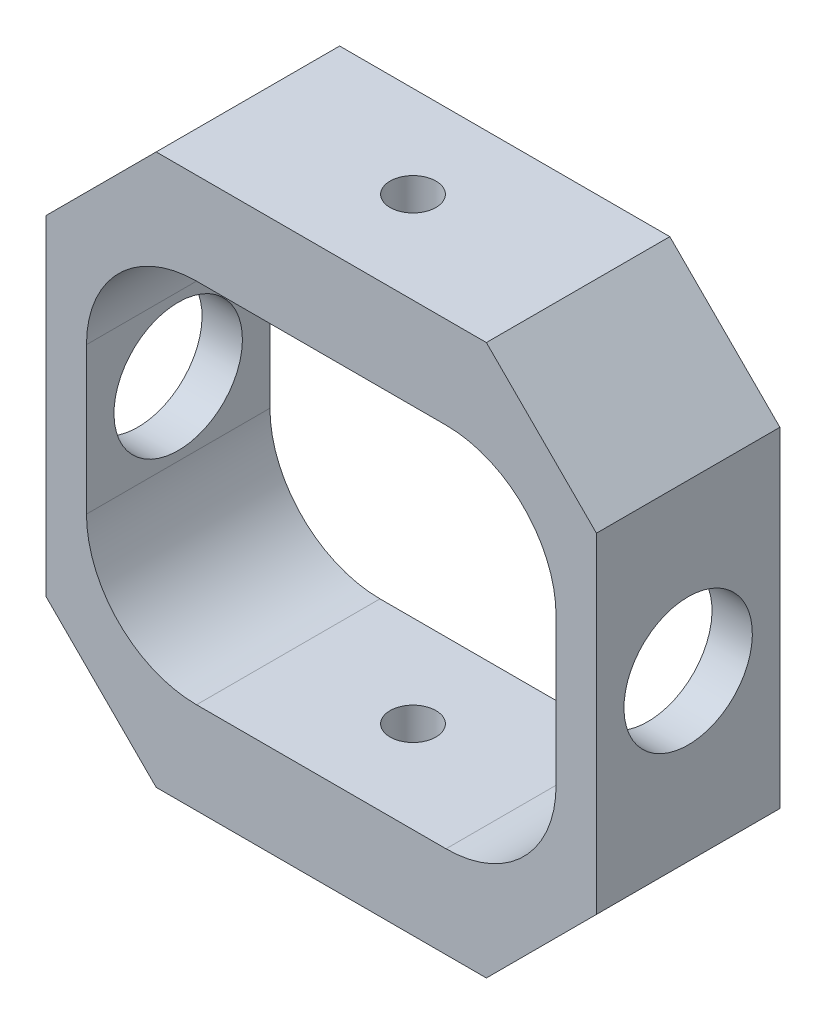
ISO-10303-21;
HEADER;
FILE_DESCRIPTION(('STEP AP214'),'2;1');
FILE_NAME('part.step','',(''),(''),'','','');
FILE_SCHEMA(('AUTOMOTIVE_DESIGN { 1 0 10303 214 1 1 1 1 }'));
ENDSEC;
DATA;
#1=APPLICATION_CONTEXT('core data for automotive mechanical design processes');
#2=APPLICATION_PROTOCOL_DEFINITION('international standard','automotive_design',2000,#1);
#3=PRODUCT_CONTEXT('',#1,'mechanical');
#4=PRODUCT('Part','Part','',(#3));
#5=PRODUCT_RELATED_PRODUCT_CATEGORY('part','',(#4));
#6=PRODUCT_DEFINITION_FORMATION('','',#4);
#7=PRODUCT_DEFINITION_CONTEXT('part definition',#1,'design');
#8=PRODUCT_DEFINITION('design','',#6,#7);
#9=PRODUCT_DEFINITION_SHAPE('','',#8);
#10=(LENGTH_UNIT() NAMED_UNIT(*) SI_UNIT(.MILLI.,.METRE.));
#11=(NAMED_UNIT(*) PLANE_ANGLE_UNIT() SI_UNIT($,.RADIAN.));
#12=(NAMED_UNIT(*) SI_UNIT($,.STERADIAN.) SOLID_ANGLE_UNIT());
#13=UNCERTAINTY_MEASURE_WITH_UNIT(LENGTH_MEASURE(1.E-05),#10,'distance_accuracy_value','');
#14=(GEOMETRIC_REPRESENTATION_CONTEXT(3) GLOBAL_UNCERTAINTY_ASSIGNED_CONTEXT((#13)) GLOBAL_UNIT_ASSIGNED_CONTEXT((#10,
#11,#12)) REPRESENTATION_CONTEXT('',''));
#15=CARTESIAN_POINT('',(0.,0.,0.));
#16=DIRECTION('',(0.,0.,1.));
#17=DIRECTION('',(1.,0.,0.));
#18=AXIS2_PLACEMENT_3D('',#15,#16,#17);
#19=CARTESIAN_POINT('',(5.2510703105545,667.332012286217,-379.357743681072));
#20=DIRECTION('',(1.,0.,0.));
#21=DIRECTION('',(0.,1.,0.));
#22=AXIS2_PLACEMENT_3D('',#19,#20,#21);
#23=CYLINDRICAL_SURFACE('',#22,3.5);
#24=CARTESIAN_POINT('',(-12.8000000000002,667.332012286217,-379.357743681072));
#25=DIRECTION('',(1.,0.,0.));
#26=DIRECTION('',(0.,1.,0.));
#27=AXIS2_PLACEMENT_3D('',#24,#25,#26);
#28=CIRCLE('',#27,3.5);
#29=CARTESIAN_POINT('',(-12.8000000000002,670.832012286217,-379.357743681072));
#30=VERTEX_POINT('',#29);
#31=EDGE_CURVE('E154',#30,#30,#28,.F.);
#32=ORIENTED_EDGE('',*,*,#31,.F.);
#33=EDGE_LOOP('',(#32));
#34=FACE_BOUND('',#33,.T.);
#35=CARTESIAN_POINT('',(-15.0000000000005,667.332012286217,-379.357743681072));
#36=DIRECTION('',(1.,0.,0.));
#37=DIRECTION('',(0.,1.,0.));
#38=AXIS2_PLACEMENT_3D('',#35,#36,#37);
#39=CIRCLE('',#38,3.5);
#40=CARTESIAN_POINT('',(-15.0000000000005,670.832012286217,-379.357743681072));
#41=VERTEX_POINT('',#40);
#42=EDGE_CURVE('E203',#41,#41,#39,.F.);
#43=ORIENTED_EDGE('',*,*,#42,.T.);
#44=EDGE_LOOP('',(#43));
#45=FACE_BOUND('',#44,.T.);
#46=ADVANCED_FACE('F17',(#34,#45),#23,.F.);
#47=CARTESIAN_POINT('',(-4.547474E-13,660.706835932994,-379.357743681072));
#48=DIRECTION('',(0.,-1.,0.));
#49=DIRECTION('',(1.,0.,0.));
#50=AXIS2_PLACEMENT_3D('',#47,#48,#49);
#51=CYLINDRICAL_SURFACE('',#50,1.25);
#52=CARTESIAN_POINT('',(-4.45973166346161E-13,682.332012286217,-379.357743681072));
#53=DIRECTION('',(0.,-1.,0.));
#54=DIRECTION('',(1.,0.,0.));
#55=AXIS2_PLACEMENT_3D('',#52,#53,#54);
#56=CIRCLE('',#55,1.25);
#57=CARTESIAN_POINT('',(1.24999999999955,682.332012286217,-379.357743681072));
#58=VERTEX_POINT('',#57);
#59=EDGE_CURVE('E20',#58,#58,#56,.F.);
#60=ORIENTED_EDGE('',*,*,#59,.T.);
#61=EDGE_LOOP('',(#60));
#62=FACE_BOUND('',#61,.T.);
#63=CARTESIAN_POINT('',(-4.48001874346161E-13,677.332012286217,-379.357743681072));
#64=DIRECTION('',(0.,-1.,0.));
#65=DIRECTION('',(1.,0.,0.));
#66=AXIS2_PLACEMENT_3D('',#63,#64,#65);
#67=CIRCLE('',#66,1.25);
#68=CARTESIAN_POINT('',(1.24999999999955,677.332012286217,-379.357743681072));
#69=VERTEX_POINT('',#68);
#70=EDGE_CURVE('E163',#69,#69,#67,.F.);
#71=ORIENTED_EDGE('',*,*,#70,.F.);
#72=EDGE_LOOP('',(#71));
#73=FACE_BOUND('',#72,.T.);
#74=ADVANCED_FACE('F353',(#62,#73),#51,.F.);
#75=CARTESIAN_POINT('',(5.2510703105545,667.332012286217,-379.357743681072));
#76=DIRECTION('',(1.,0.,0.));
#77=DIRECTION('',(0.,1.,0.));
#78=AXIS2_PLACEMENT_3D('',#75,#76,#77);
#79=CYLINDRICAL_SURFACE('',#78,3.5);
#80=CARTESIAN_POINT('',(12.7999999999993,667.332012286217,-379.357743681072));
#81=DIRECTION('',(1.,0.,0.));
#82=DIRECTION('',(0.,1.,0.));
#83=AXIS2_PLACEMENT_3D('',#80,#81,#82);
#84=CIRCLE('',#83,3.5);
#85=CARTESIAN_POINT('',(12.7999999999993,670.832012286217,-379.357743681072));
#86=VERTEX_POINT('',#85);
#87=EDGE_CURVE('E159',#86,#86,#84,.T.);
#88=ORIENTED_EDGE('',*,*,#87,.F.);
#89=EDGE_LOOP('',(#88));
#90=FACE_BOUND('',#89,.T.);
#91=CARTESIAN_POINT('',(14.9999999999995,667.332012286217,-379.357743681072));
#92=DIRECTION('',(1.,0.,0.));
#93=DIRECTION('',(0.,1.,0.));
#94=AXIS2_PLACEMENT_3D('',#91,#92,#93);
#95=CIRCLE('',#94,3.5);
#96=CARTESIAN_POINT('',(14.9999999999995,670.832012286217,-379.357743681072));
#97=VERTEX_POINT('',#96);
#98=EDGE_CURVE('E155',#97,#97,#95,.T.);
#99=ORIENTED_EDGE('',*,*,#98,.T.);
#100=EDGE_LOOP('',(#99));
#101=FACE_BOUND('',#100,.T.);
#102=ADVANCED_FACE('F345',(#90,#101),#79,.F.);
#103=CARTESIAN_POINT('',(-4.547474E-13,660.706835932994,-379.357743681072));
#104=DIRECTION('',(0.,-1.,0.));
#105=DIRECTION('',(1.,0.,0.));
#106=AXIS2_PLACEMENT_3D('',#103,#104,#105);
#107=CYLINDRICAL_SURFACE('',#106,1.25);
#108=CARTESIAN_POINT('',(-4.58145414346161E-13,652.332012286217,-379.357743681072));
#109=DIRECTION('',(0.,-1.,0.));
#110=DIRECTION('',(1.,0.,0.));
#111=AXIS2_PLACEMENT_3D('',#108,#109,#110);
#112=CIRCLE('',#111,1.25);
#113=CARTESIAN_POINT('',(1.24999999999954,652.332012286217,-379.357743681072));
#114=VERTEX_POINT('',#113);
#115=EDGE_CURVE('E199',#114,#114,#112,.T.);
#116=ORIENTED_EDGE('',*,*,#115,.T.);
#117=EDGE_LOOP('',(#116));
#118=FACE_BOUND('',#117,.T.);
#119=CARTESIAN_POINT('',(-4.56116706346161E-13,657.332012286217,-379.357743681072));
#120=DIRECTION('',(0.,-1.,0.));
#121=DIRECTION('',(1.,0.,0.));
#122=AXIS2_PLACEMENT_3D('',#119,#120,#121);
#123=CIRCLE('',#122,1.25);
#124=CARTESIAN_POINT('',(1.24999999999954,657.332012286217,-379.357743681072));
#125=VERTEX_POINT('',#124);
#126=EDGE_CURVE('E151',#125,#125,#123,.T.);
#127=ORIENTED_EDGE('',*,*,#126,.F.);
#128=EDGE_LOOP('',(#127));
#129=FACE_BOUND('',#128,.T.);
#130=ADVANCED_FACE('F343',(#118,#129),#107,.F.);
#131=CARTESIAN_POINT('',(-4.547474E-13,667.332012286217,-384.357743681072));
#132=DIRECTION('',(0.,0.,1.));
#133=DIRECTION('',(1.,0.,0.));
#134=AXIS2_PLACEMENT_3D('',#131,#132,#133);
#135=PLANE('',#134);
#136=CARTESIAN_POINT('',(-6.80000000000018,663.332012286217,-384.357743681072));
#137=DIRECTION('',(0.,0.,-1.));
#138=DIRECTION('',(-1.,0.,0.));
#139=AXIS2_PLACEMENT_3D('',#136,#137,#138);
#140=CIRCLE('',#139,6.);
#141=CARTESIAN_POINT('',(-12.8000000000002,663.332012286217,-384.357743681072));
#142=VERTEX_POINT('',#141);
#143=CARTESIAN_POINT('',(-6.80000000000018,657.332012286217,-384.357743681072));
#144=VERTEX_POINT('',#143);
#145=EDGE_CURVE('E178',#142,#144,#140,.F.);
#146=ORIENTED_EDGE('',*,*,#145,.T.);
#147=DIRECTION('',(1.,0.,0.));
#148=VECTOR('',#147,1.);
#149=CARTESIAN_POINT('',(0.999999999999545,657.332012286217,-384.357743681072));
#150=LINE('',#149,#148);
#151=CARTESIAN_POINT('',(6.79999999999927,657.332012286217,-384.357743681072));
#152=VERTEX_POINT('',#151);
#153=EDGE_CURVE('E149',#152,#144,#150,.F.);
#154=ORIENTED_EDGE('',*,*,#153,.F.);
#155=CARTESIAN_POINT('',(6.79999999999927,663.332012286217,-384.357743681072));
#156=DIRECTION('',(0.,0.,-1.));
#157=DIRECTION('',(-1.,0.,0.));
#158=AXIS2_PLACEMENT_3D('',#155,#156,#157);
#159=CIRCLE('',#158,6.);
#160=CARTESIAN_POINT('',(12.7999999999993,663.332012286217,-384.357743681072));
#161=VERTEX_POINT('',#160);
#162=EDGE_CURVE('E183',#152,#161,#159,.F.);
#163=ORIENTED_EDGE('',*,*,#162,.T.);
#164=DIRECTION('',(0.,1.,0.));
#165=VECTOR('',#164,1.);
#166=CARTESIAN_POINT('',(12.7999999999993,667.332012286217,-384.357743681072));
#167=LINE('',#166,#165);
#168=CARTESIAN_POINT('',(12.7999999999993,671.332012286217,-384.357743681072));
#169=VERTEX_POINT('',#168);
#170=EDGE_CURVE('E156',#169,#161,#167,.F.);
#171=ORIENTED_EDGE('',*,*,#170,.F.);
#172=CARTESIAN_POINT('',(6.79999999999927,671.332012286217,-384.357743681072));
#173=DIRECTION('',(0.,0.,-1.));
#174=DIRECTION('',(-1.,0.,0.));
#175=AXIS2_PLACEMENT_3D('',#172,#173,#174);
#176=CIRCLE('',#175,6.);
#177=CARTESIAN_POINT('',(6.79999999999927,677.332012286217,-384.357743681072));
#178=VERTEX_POINT('',#177);
#179=EDGE_CURVE('E188',#169,#178,#176,.F.);
#180=ORIENTED_EDGE('',*,*,#179,.T.);
#181=DIRECTION('',(1.,0.,0.));
#182=VECTOR('',#181,1.);
#183=CARTESIAN_POINT('',(0.999999999999545,677.332012286217,-384.357743681072));
#184=LINE('',#183,#182);
#185=CARTESIAN_POINT('',(-6.80000000000018,677.332012286217,-384.357743681072));
#186=VERTEX_POINT('',#185);
#187=EDGE_CURVE('E161',#186,#178,#184,.T.);
#188=ORIENTED_EDGE('',*,*,#187,.F.);
#189=CARTESIAN_POINT('',(-6.80000000000018,671.332012286217,-384.357743681072));
#190=DIRECTION('',(0.,0.,1.));
#191=DIRECTION('',(1.,0.,0.));
#192=AXIS2_PLACEMENT_3D('',#189,#190,#191);
#193=CIRCLE('',#192,6.);
#194=CARTESIAN_POINT('',(-12.8000000000002,671.332012286217,-384.357743681072));
#195=VERTEX_POINT('',#194);
#196=EDGE_CURVE('E85',#186,#195,#193,.T.);
#197=ORIENTED_EDGE('',*,*,#196,.T.);
#198=DIRECTION('',(0.,1.,0.));
#199=VECTOR('',#198,1.);
#200=CARTESIAN_POINT('',(-12.8000000000002,667.332012286217,-384.357743681072));
#201=LINE('',#200,#199);
#202=EDGE_CURVE('E91',#142,#195,#201,.T.);
#203=ORIENTED_EDGE('',*,*,#202,.F.);
#204=EDGE_LOOP('',(#146,#154,#163,#171,#180,#188,#197,#203));
#205=FACE_BOUND('',#204,.T.);
#206=DIRECTION('',(0.,1.,0.));
#207=VECTOR('',#206,1.);
#208=CARTESIAN_POINT('',(14.9999999999995,667.332012286217,-384.357743681072));
#209=LINE('',#208,#207);
#210=CARTESIAN_POINT('',(14.9999999999995,676.332012286217,-384.357743681072));
#211=VERTEX_POINT('',#210);
#212=CARTESIAN_POINT('',(14.9999999999995,658.332012286217,-384.357743681072));
#213=VERTEX_POINT('',#212);
#214=EDGE_CURVE('E99',#211,#213,#209,.F.);
#215=ORIENTED_EDGE('',*,*,#214,.T.);
#216=DIRECTION('',(0.707106781186548,0.707106781186547,0.));
#217=VECTOR('',#216,1.);
#218=CARTESIAN_POINT('',(11.9999999999995,655.332012286217,-384.357743681072));
#219=LINE('',#218,#217);
#220=CARTESIAN_POINT('',(8.99999999999954,652.332012286217,-384.357743681072));
#221=VERTEX_POINT('',#220);
#222=EDGE_CURVE('E201',#221,#213,#219,.T.);
#223=ORIENTED_EDGE('',*,*,#222,.F.);
#224=DIRECTION('',(1.,0.,0.));
#225=VECTOR('',#224,1.);
#226=CARTESIAN_POINT('',(-4.547474E-13,652.332012286217,-384.357743681072));
#227=LINE('',#226,#225);
#228=CARTESIAN_POINT('',(-9.00000000000046,652.332012286217,-384.357743681072));
#229=VERTEX_POINT('',#228);
#230=EDGE_CURVE('E271',#221,#229,#227,.F.);
#231=ORIENTED_EDGE('',*,*,#230,.T.);
#232=DIRECTION('',(0.707106781186547,-0.707106781186548,0.));
#233=VECTOR('',#232,1.);
#234=CARTESIAN_POINT('',(-12.0000000000005,655.332012286217,-384.357743681072));
#235=LINE('',#234,#233);
#236=CARTESIAN_POINT('',(-15.0000000000005,658.332012286217,-384.357743681072));
#237=VERTEX_POINT('',#236);
#238=EDGE_CURVE('E205',#237,#229,#235,.T.);
#239=ORIENTED_EDGE('',*,*,#238,.F.);
#240=DIRECTION('',(0.,1.,0.));
#241=VECTOR('',#240,1.);
#242=CARTESIAN_POINT('',(-15.0000000000005,667.332012286217,-384.357743681072));
#243=LINE('',#242,#241);
#244=CARTESIAN_POINT('',(-15.0000000000005,676.332012286217,-384.357743681072));
#245=VERTEX_POINT('',#244);
#246=EDGE_CURVE('E213',#237,#245,#243,.T.);
#247=ORIENTED_EDGE('',*,*,#246,.T.);
#248=DIRECTION('',(-0.707106781186548,-0.707106781186547,0.));
#249=VECTOR('',#248,1.);
#250=CARTESIAN_POINT('',(-12.0000000000005,679.332012286217,-384.357743681072));
#251=LINE('',#250,#249);
#252=CARTESIAN_POINT('',(-9.00000000000046,682.332012286217,-384.357743681072));
#253=VERTEX_POINT('',#252);
#254=EDGE_CURVE('E118',#253,#245,#251,.T.);
#255=ORIENTED_EDGE('',*,*,#254,.F.);
#256=DIRECTION('',(1.,0.,0.));
#257=VECTOR('',#256,1.);
#258=CARTESIAN_POINT('',(-4.547474E-13,682.332012286217,-384.357743681072));
#259=LINE('',#258,#257);
#260=CARTESIAN_POINT('',(8.99999999999954,682.332012286217,-384.357743681072));
#261=VERTEX_POINT('',#260);
#262=EDGE_CURVE('E120',#253,#261,#259,.T.);
#263=ORIENTED_EDGE('',*,*,#262,.T.);
#264=DIRECTION('',(-0.707106781186547,0.707106781186548,0.));
#265=VECTOR('',#264,1.);
#266=CARTESIAN_POINT('',(11.9999999999995,679.332012286217,-384.357743681072));
#267=LINE('',#266,#265);
#268=EDGE_CURVE('E123',#211,#261,#267,.T.);
#269=ORIENTED_EDGE('',*,*,#268,.F.);
#270=EDGE_LOOP('',(#215,#223,#231,#239,#247,#255,#263,#269));
#271=FACE_BOUND('',#270,.T.);
#272=ADVANCED_FACE('F122',(#205,#271),#135,.F.);
#273=CARTESIAN_POINT('',(11.9999999999995,679.332012286217,-379.357743681072));
#274=DIRECTION('',(0.707106781186548,0.707106781186547,0.));
#275=DIRECTION('',(-0.707106781186547,0.707106781186548,0.));
#276=AXIS2_PLACEMENT_3D('',#273,#274,#275);
#277=PLANE('',#276);
#278=DIRECTION('',(-0.707106781186544,0.707106781186551,0.));
#279=VECTOR('',#278,1.);
#280=CARTESIAN_POINT('',(14.9999999999995,676.332012286217,-374.357743681072));
#281=LINE('',#280,#279);
#282=CARTESIAN_POINT('',(14.9999999999995,676.332012286217,-374.357743681072));
#283=VERTEX_POINT('',#282);
#284=CARTESIAN_POINT('',(8.99999999999953,682.332012286217,-374.357743681072));
#285=VERTEX_POINT('',#284);
#286=EDGE_CURVE('E244',#283,#285,#281,.T.);
#287=ORIENTED_EDGE('',*,*,#286,.F.);
#288=DIRECTION('',(0.,0.,1.));
#289=VECTOR('',#288,1.);
#290=CARTESIAN_POINT('',(14.9999999999995,676.332012286217,-379.357743681072));
#291=LINE('',#290,#289);
#292=EDGE_CURVE('E138',#283,#211,#291,.F.);
#293=ORIENTED_EDGE('',*,*,#292,.T.);
#294=ORIENTED_EDGE('',*,*,#268,.T.);
#295=DIRECTION('',(0.,0.,-1.));
#296=VECTOR('',#295,1.);
#297=CARTESIAN_POINT('',(8.99999999999955,682.332012286217,-379.357743681072));
#298=LINE('',#297,#296);
#299=EDGE_CURVE('E129',#261,#285,#298,.F.);
#300=ORIENTED_EDGE('',*,*,#299,.T.);
#301=EDGE_LOOP('',(#287,#293,#294,#300));
#302=FACE_BOUND('',#301,.T.);
#303=ADVANCED_FACE('F134',(#302),#277,.T.);
#304=CARTESIAN_POINT('',(-4.547474E-13,682.332012286217,-379.357743681072));
#305=DIRECTION('',(0.,-1.,0.));
#306=DIRECTION('',(0.,0.,-1.));
#307=AXIS2_PLACEMENT_3D('',#304,#305,#306);
#308=PLANE('',#307);
#309=ORIENTED_EDGE('',*,*,#59,.F.);
#310=EDGE_LOOP('',(#309));
#311=FACE_BOUND('',#310,.T.);
#312=ORIENTED_EDGE('',*,*,#262,.F.);
#313=DIRECTION('',(0.,0.,1.));
#314=VECTOR('',#313,1.);
#315=CARTESIAN_POINT('',(-9.00000000000048,682.332012286217,-379.357743681072));
#316=LINE('',#315,#314);
#317=CARTESIAN_POINT('',(-9.00000000000046,682.332012286217,-374.357743681072));
#318=VERTEX_POINT('',#317);
#319=EDGE_CURVE('E220',#318,#253,#316,.F.);
#320=ORIENTED_EDGE('',*,*,#319,.F.);
#321=DIRECTION('',(1.,0.,0.));
#322=VECTOR('',#321,1.);
#323=CARTESIAN_POINT('',(-4.547474E-13,682.332012286217,-374.357743681072));
#324=LINE('',#323,#322);
#325=EDGE_CURVE('E142',#285,#318,#324,.F.);
#326=ORIENTED_EDGE('',*,*,#325,.F.);
#327=ORIENTED_EDGE('',*,*,#299,.F.);
#328=EDGE_LOOP('',(#312,#320,#326,#327));
#329=FACE_BOUND('',#328,.T.);
#330=ADVANCED_FACE('F140',(#311,#329),#308,.F.);
#331=CARTESIAN_POINT('',(-12.0000000000005,679.332012286217,-379.357743681072));
#332=DIRECTION('',(-0.707106781186547,0.707106781186548,0.));
#333=DIRECTION('',(-0.707106781186548,-0.707106781186547,0.));
#334=AXIS2_PLACEMENT_3D('',#331,#332,#333);
#335=PLANE('',#334);
#336=DIRECTION('',(-0.70710678118655,-0.707106781186545,0.));
#337=VECTOR('',#336,1.);
#338=CARTESIAN_POINT('',(-9.00000000000045,682.332012286217,-374.357743681072));
#339=LINE('',#338,#337);
#340=CARTESIAN_POINT('',(-15.0000000000005,676.332012286217,-374.357743681072));
#341=VERTEX_POINT('',#340);
#342=EDGE_CURVE('E239',#318,#341,#339,.T.);
#343=ORIENTED_EDGE('',*,*,#342,.F.);
#344=ORIENTED_EDGE('',*,*,#319,.T.);
#345=ORIENTED_EDGE('',*,*,#254,.T.);
#346=DIRECTION('',(0.,0.,-1.));
#347=VECTOR('',#346,1.);
#348=CARTESIAN_POINT('',(-15.0000000000005,676.332012286217,-379.357743681072));
#349=LINE('',#348,#347);
#350=EDGE_CURVE('E206',#245,#341,#349,.F.);
#351=ORIENTED_EDGE('',*,*,#350,.T.);
#352=EDGE_LOOP('',(#343,#344,#345,#351));
#353=FACE_BOUND('',#352,.T.);
#354=ADVANCED_FACE('F223',(#353),#335,.T.);
#355=CARTESIAN_POINT('',(-15.0000000000005,667.332012286217,-379.357743681072));
#356=DIRECTION('',(1.,0.,0.));
#357=DIRECTION('',(0.,0.,-1.));
#358=AXIS2_PLACEMENT_3D('',#355,#356,#357);
#359=PLANE('',#358);
#360=ORIENTED_EDGE('',*,*,#42,.F.);
#361=EDGE_LOOP('',(#360));
#362=FACE_BOUND('',#361,.T.);
#363=ORIENTED_EDGE('',*,*,#246,.F.);
#364=DIRECTION('',(0.,0.,1.));
#365=VECTOR('',#364,1.);
#366=CARTESIAN_POINT('',(-15.0000000000005,658.332012286217,-379.357743681072));
#367=LINE('',#366,#365);
#368=CARTESIAN_POINT('',(-15.0000000000005,658.332012286217,-374.357743681072));
#369=VERTEX_POINT('',#368);
#370=EDGE_CURVE('E210',#369,#237,#367,.F.);
#371=ORIENTED_EDGE('',*,*,#370,.F.);
#372=DIRECTION('',(0.,1.,0.));
#373=VECTOR('',#372,1.);
#374=CARTESIAN_POINT('',(-15.0000000000005,667.332012286217,-374.357743681072));
#375=LINE('',#374,#373);
#376=EDGE_CURVE('E230',#341,#369,#375,.F.);
#377=ORIENTED_EDGE('',*,*,#376,.F.);
#378=ORIENTED_EDGE('',*,*,#350,.F.);
#379=EDGE_LOOP('',(#363,#371,#377,#378));
#380=FACE_BOUND('',#379,.T.);
#381=ADVANCED_FACE('F226',(#362,#380),#359,.F.);
#382=CARTESIAN_POINT('',(-12.0000000000005,655.332012286217,-379.357743681072));
#383=DIRECTION('',(-0.707106781186548,-0.707106781186547,0.));
#384=DIRECTION('',(0.707106781186547,-0.707106781186548,0.));
#385=AXIS2_PLACEMENT_3D('',#382,#383,#384);
#386=PLANE('',#385);
#387=DIRECTION('',(0.70710678118655,-0.707106781186545,0.));
#388=VECTOR('',#387,1.);
#389=CARTESIAN_POINT('',(-15.0000000000005,658.332012286217,-374.357743681072));
#390=LINE('',#389,#388);
#391=CARTESIAN_POINT('',(-9.00000000000047,652.332012286217,-374.357743681072));
#392=VERTEX_POINT('',#391);
#393=EDGE_CURVE('E238',#369,#392,#390,.T.);
#394=ORIENTED_EDGE('',*,*,#393,.F.);
#395=ORIENTED_EDGE('',*,*,#370,.T.);
#396=ORIENTED_EDGE('',*,*,#238,.T.);
#397=DIRECTION('',(0.,0.,1.));
#398=VECTOR('',#397,1.);
#399=CARTESIAN_POINT('',(-9.00000000000045,652.332012286217,-379.357743681072));
#400=LINE('',#399,#398);
#401=EDGE_CURVE('E202',#229,#392,#400,.T.);
#402=ORIENTED_EDGE('',*,*,#401,.T.);
#403=EDGE_LOOP('',(#394,#395,#396,#402));
#404=FACE_BOUND('',#403,.T.);
#405=ADVANCED_FACE('F273',(#404),#386,.T.);
#406=CARTESIAN_POINT('',(-4.547474E-13,652.332012286217,-379.357743681072));
#407=DIRECTION('',(0.,1.,0.));
#408=DIRECTION('',(0.,0.,1.));
#409=AXIS2_PLACEMENT_3D('',#406,#407,#408);
#410=PLANE('',#409);
#411=ORIENTED_EDGE('',*,*,#115,.F.);
#412=EDGE_LOOP('',(#411));
#413=FACE_BOUND('',#412,.T.);
#414=ORIENTED_EDGE('',*,*,#230,.F.);
#415=DIRECTION('',(0.,0.,1.));
#416=VECTOR('',#415,1.);
#417=CARTESIAN_POINT('',(8.99999999999951,652.332012286217,-379.357743681072));
#418=LINE('',#417,#416);
#419=CARTESIAN_POINT('',(8.99999999999954,652.332012286217,-374.357743681072));
#420=VERTEX_POINT('',#419);
#421=EDGE_CURVE('E265',#420,#221,#418,.F.);
#422=ORIENTED_EDGE('',*,*,#421,.F.);
#423=DIRECTION('',(1.,0.,0.));
#424=VECTOR('',#423,1.);
#425=CARTESIAN_POINT('',(-4.547474E-13,652.332012286217,-374.357743681072));
#426=LINE('',#425,#424);
#427=EDGE_CURVE('E279',#392,#420,#426,.T.);
#428=ORIENTED_EDGE('',*,*,#427,.F.);
#429=ORIENTED_EDGE('',*,*,#401,.F.);
#430=EDGE_LOOP('',(#414,#422,#428,#429));
#431=FACE_BOUND('',#430,.T.);
#432=ADVANCED_FACE('F384',(#413,#431),#410,.F.);
#433=CARTESIAN_POINT('',(11.9999999999995,655.332012286217,-379.357743681072));
#434=DIRECTION('',(0.707106781186547,-0.707106781186548,0.));
#435=DIRECTION('',(0.707106781186548,0.707106781186547,0.));
#436=AXIS2_PLACEMENT_3D('',#433,#434,#435);
#437=PLANE('',#436);
#438=DIRECTION('',(0.707106781186544,0.707106781186551,0.));
#439=VECTOR('',#438,1.);
#440=CARTESIAN_POINT('',(8.99999999999955,652.332012286217,-374.357743681072));
#441=LINE('',#440,#439);
#442=CARTESIAN_POINT('',(14.9999999999995,658.332012286217,-374.357743681072));
#443=VERTEX_POINT('',#442);
#444=EDGE_CURVE('E280',#420,#443,#441,.T.);
#445=ORIENTED_EDGE('',*,*,#444,.F.);
#446=ORIENTED_EDGE('',*,*,#421,.T.);
#447=ORIENTED_EDGE('',*,*,#222,.T.);
#448=DIRECTION('',(0.,0.,1.));
#449=VECTOR('',#448,1.);
#450=CARTESIAN_POINT('',(14.9999999999995,658.332012286217,-379.357743681072));
#451=LINE('',#450,#449);
#452=EDGE_CURVE('E261',#213,#443,#451,.T.);
#453=ORIENTED_EDGE('',*,*,#452,.T.);
#454=EDGE_LOOP('',(#445,#446,#447,#453));
#455=FACE_BOUND('',#454,.T.);
#456=ADVANCED_FACE('F380',(#455),#437,.T.);
#457=CARTESIAN_POINT('',(14.9999999999995,667.332012286217,-379.357743681072));
#458=DIRECTION('',(-1.,0.,0.));
#459=DIRECTION('',(0.,0.,1.));
#460=AXIS2_PLACEMENT_3D('',#457,#458,#459);
#461=PLANE('',#460);
#462=ORIENTED_EDGE('',*,*,#98,.F.);
#463=EDGE_LOOP('',(#462));
#464=FACE_BOUND('',#463,.T.);
#465=DIRECTION('',(0.,1.,0.));
#466=VECTOR('',#465,1.);
#467=CARTESIAN_POINT('',(14.9999999999995,667.332012286217,-374.357743681072));
#468=LINE('',#467,#466);
#469=EDGE_CURVE('E284',#443,#283,#468,.T.);
#470=ORIENTED_EDGE('',*,*,#469,.F.);
#471=ORIENTED_EDGE('',*,*,#452,.F.);
#472=ORIENTED_EDGE('',*,*,#214,.F.);
#473=ORIENTED_EDGE('',*,*,#292,.F.);
#474=EDGE_LOOP('',(#470,#471,#472,#473));
#475=FACE_BOUND('',#474,.T.);
#476=ADVANCED_FACE('F376',(#464,#475),#461,.F.);
#477=CARTESIAN_POINT('',(-12.8000000000002,667.332012286217,-379.357743681072));
#478=DIRECTION('',(1.,0.,0.));
#479=DIRECTION('',(0.,0.,-1.));
#480=AXIS2_PLACEMENT_3D('',#477,#478,#479);
#481=PLANE('',#480);
#482=ORIENTED_EDGE('',*,*,#31,.T.);
#483=EDGE_LOOP('',(#482));
#484=FACE_BOUND('',#483,.T.);
#485=DIRECTION('',(0.,0.,1.));
#486=VECTOR('',#485,1.);
#487=CARTESIAN_POINT('',(-12.8000000000002,671.332012286217,-379.357743681072));
#488=LINE('',#487,#486);
#489=CARTESIAN_POINT('',(-12.8000000000002,671.332012286217,-374.357743681072));
#490=VERTEX_POINT('',#489);
#491=EDGE_CURVE('E194',#195,#490,#488,.T.);
#492=ORIENTED_EDGE('',*,*,#491,.T.);
#493=DIRECTION('',(0.,1.,0.));
#494=VECTOR('',#493,1.);
#495=CARTESIAN_POINT('',(-12.8000000000002,667.332012286217,-374.357743681072));
#496=LINE('',#495,#494);
#497=CARTESIAN_POINT('',(-12.8000000000002,663.332012286217,-374.357743681072));
#498=VERTEX_POINT('',#497);
#499=EDGE_CURVE('E177',#498,#490,#496,.T.);
#500=ORIENTED_EDGE('',*,*,#499,.F.);
#501=DIRECTION('',(0.,0.,-1.));
#502=VECTOR('',#501,1.);
#503=CARTESIAN_POINT('',(-12.8000000000002,663.332012286217,-379.357743681072));
#504=LINE('',#503,#502);
#505=EDGE_CURVE('E180',#498,#142,#504,.T.);
#506=ORIENTED_EDGE('',*,*,#505,.T.);
#507=ORIENTED_EDGE('',*,*,#202,.T.);
#508=EDGE_LOOP('',(#492,#500,#506,#507));
#509=FACE_BOUND('',#508,.T.);
#510=ADVANCED_FACE('F307',(#484,#509),#481,.T.);
#511=CARTESIAN_POINT('',(-6.80000000000018,671.332012286217,-379.357743681072));
#512=DIRECTION('',(0.,0.,1.));
#513=DIRECTION('',(1.,0.,0.));
#514=AXIS2_PLACEMENT_3D('',#511,#512,#513);
#515=CYLINDRICAL_SURFACE('',#514,6.);
#516=DIRECTION('',(0.,0.,-1.));
#517=VECTOR('',#516,1.);
#518=CARTESIAN_POINT('',(-6.80000000000018,677.332012286217,-379.357743681072));
#519=LINE('',#518,#517);
#520=CARTESIAN_POINT('',(-6.80000000000018,677.332012286217,-374.357743681072));
#521=VERTEX_POINT('',#520);
#522=EDGE_CURVE('E164',#521,#186,#519,.T.);
#523=ORIENTED_EDGE('',*,*,#522,.F.);
#524=CARTESIAN_POINT('',(-6.80000000000018,671.332012286217,-374.357743681072));
#525=DIRECTION('',(0.,0.,1.));
#526=DIRECTION('',(1.,0.,0.));
#527=AXIS2_PLACEMENT_3D('',#524,#525,#526);
#528=CIRCLE('',#527,6.);
#529=EDGE_CURVE('E174',#490,#521,#528,.F.);
#530=ORIENTED_EDGE('',*,*,#529,.F.);
#531=ORIENTED_EDGE('',*,*,#491,.F.);
#532=ORIENTED_EDGE('',*,*,#196,.F.);
#533=EDGE_LOOP('',(#523,#530,#531,#532));
#534=FACE_BOUND('',#533,.T.);
#535=ADVANCED_FACE('F310',(#534),#515,.F.);
#536=CARTESIAN_POINT('',(0.999999999999545,677.332012286217,-379.357743681072));
#537=DIRECTION('',(0.,-1.,0.));
#538=DIRECTION('',(0.,0.,-1.));
#539=AXIS2_PLACEMENT_3D('',#536,#537,#538);
#540=PLANE('',#539);
#541=ORIENTED_EDGE('',*,*,#70,.T.);
#542=EDGE_LOOP('',(#541));
#543=FACE_BOUND('',#542,.T.);
#544=DIRECTION('',(0.,0.,-1.));
#545=VECTOR('',#544,1.);
#546=CARTESIAN_POINT('',(6.79999999999927,677.332012286217,-379.357743681072));
#547=LINE('',#546,#545);
#548=CARTESIAN_POINT('',(6.79999999999927,677.332012286217,-374.357743681072));
#549=VERTEX_POINT('',#548);
#550=EDGE_CURVE('E190',#178,#549,#547,.F.);
#551=ORIENTED_EDGE('',*,*,#550,.T.);
#552=DIRECTION('',(1.,0.,0.));
#553=VECTOR('',#552,1.);
#554=CARTESIAN_POINT('',(-4.547474E-13,677.332012286217,-374.357743681072));
#555=LINE('',#554,#553);
#556=EDGE_CURVE('E173',#521,#549,#555,.T.);
#557=ORIENTED_EDGE('',*,*,#556,.F.);
#558=ORIENTED_EDGE('',*,*,#522,.T.);
#559=ORIENTED_EDGE('',*,*,#187,.T.);
#560=EDGE_LOOP('',(#551,#557,#558,#559));
#561=FACE_BOUND('',#560,.T.);
#562=ADVANCED_FACE('F312',(#543,#561),#540,.T.);
#563=CARTESIAN_POINT('',(6.79999999999927,671.332012286217,-379.357743681072));
#564=DIRECTION('',(0.,0.,-1.));
#565=DIRECTION('',(-1.,0.,0.));
#566=AXIS2_PLACEMENT_3D('',#563,#564,#565);
#567=CYLINDRICAL_SURFACE('',#566,6.);
#568=ORIENTED_EDGE('',*,*,#550,.F.);
#569=ORIENTED_EDGE('',*,*,#179,.F.);
#570=DIRECTION('',(0.,0.,1.));
#571=VECTOR('',#570,1.);
#572=CARTESIAN_POINT('',(12.7999999999993,671.332012286217,-379.357743681072));
#573=LINE('',#572,#571);
#574=CARTESIAN_POINT('',(12.7999999999993,671.332012286217,-374.357743681072));
#575=VERTEX_POINT('',#574);
#576=EDGE_CURVE('E160',#575,#169,#573,.F.);
#577=ORIENTED_EDGE('',*,*,#576,.F.);
#578=CARTESIAN_POINT('',(6.79999999999927,671.332012286217,-374.357743681072));
#579=DIRECTION('',(0.,0.,-1.));
#580=DIRECTION('',(-1.,0.,0.));
#581=AXIS2_PLACEMENT_3D('',#578,#579,#580);
#582=CIRCLE('',#581,6.);
#583=EDGE_CURVE('E170',#549,#575,#582,.T.);
#584=ORIENTED_EDGE('',*,*,#583,.F.);
#585=EDGE_LOOP('',(#568,#569,#577,#584));
#586=FACE_BOUND('',#585,.T.);
#587=ADVANCED_FACE('F316',(#586),#567,.F.);
#588=CARTESIAN_POINT('',(12.7999999999993,667.332012286217,-379.357743681072));
#589=DIRECTION('',(-1.,0.,0.));
#590=DIRECTION('',(0.,0.,1.));
#591=AXIS2_PLACEMENT_3D('',#588,#589,#590);
#592=PLANE('',#591);
#593=ORIENTED_EDGE('',*,*,#87,.T.);
#594=EDGE_LOOP('',(#593));
#595=FACE_BOUND('',#594,.T.);
#596=DIRECTION('',(0.,0.,-1.));
#597=VECTOR('',#596,1.);
#598=CARTESIAN_POINT('',(12.7999999999993,663.332012286217,-379.357743681072));
#599=LINE('',#598,#597);
#600=CARTESIAN_POINT('',(12.7999999999993,663.332012286217,-374.357743681072));
#601=VERTEX_POINT('',#600);
#602=EDGE_CURVE('E185',#161,#601,#599,.F.);
#603=ORIENTED_EDGE('',*,*,#602,.T.);
#604=DIRECTION('',(0.,1.,0.));
#605=VECTOR('',#604,1.);
#606=CARTESIAN_POINT('',(12.7999999999993,667.332012286217,-374.357743681072));
#607=LINE('',#606,#605);
#608=EDGE_CURVE('E169',#575,#601,#607,.F.);
#609=ORIENTED_EDGE('',*,*,#608,.F.);
#610=ORIENTED_EDGE('',*,*,#576,.T.);
#611=ORIENTED_EDGE('',*,*,#170,.T.);
#612=EDGE_LOOP('',(#603,#609,#610,#611));
#613=FACE_BOUND('',#612,.T.);
#614=ADVANCED_FACE('F319',(#595,#613),#592,.T.);
#615=CARTESIAN_POINT('',(6.79999999999927,663.332012286217,-379.357743681072));
#616=DIRECTION('',(0.,0.,-1.));
#617=DIRECTION('',(-1.,0.,0.));
#618=AXIS2_PLACEMENT_3D('',#615,#616,#617);
#619=CYLINDRICAL_SURFACE('',#618,6.);
#620=ORIENTED_EDGE('',*,*,#602,.F.);
#621=ORIENTED_EDGE('',*,*,#162,.F.);
#622=DIRECTION('',(0.,0.,1.));
#623=VECTOR('',#622,1.);
#624=CARTESIAN_POINT('',(6.79999999999927,657.332012286217,-379.357743681072));
#625=LINE('',#624,#623);
#626=CARTESIAN_POINT('',(6.79999999999927,657.332012286217,-374.357743681072));
#627=VERTEX_POINT('',#626);
#628=EDGE_CURVE('E152',#627,#152,#625,.F.);
#629=ORIENTED_EDGE('',*,*,#628,.F.);
#630=CARTESIAN_POINT('',(6.79999999999927,663.332012286217,-374.357743681072));
#631=DIRECTION('',(0.,0.,-1.));
#632=DIRECTION('',(-1.,0.,0.));
#633=AXIS2_PLACEMENT_3D('',#630,#631,#632);
#634=CIRCLE('',#633,6.);
#635=EDGE_CURVE('E166',#601,#627,#634,.T.);
#636=ORIENTED_EDGE('',*,*,#635,.F.);
#637=EDGE_LOOP('',(#620,#621,#629,#636));
#638=FACE_BOUND('',#637,.T.);
#639=ADVANCED_FACE('F300',(#638),#619,.F.);
#640=CARTESIAN_POINT('',(0.999999999999545,657.332012286217,-379.357743681072));
#641=DIRECTION('',(0.,1.,0.));
#642=DIRECTION('',(0.,0.,1.));
#643=AXIS2_PLACEMENT_3D('',#640,#641,#642);
#644=PLANE('',#643);
#645=ORIENTED_EDGE('',*,*,#126,.T.);
#646=EDGE_LOOP('',(#645));
#647=FACE_BOUND('',#646,.T.);
#648=ORIENTED_EDGE('',*,*,#628,.T.);
#649=ORIENTED_EDGE('',*,*,#153,.T.);
#650=DIRECTION('',(0.,0.,-1.));
#651=VECTOR('',#650,1.);
#652=CARTESIAN_POINT('',(-6.80000000000018,657.332012286217,-379.357743681072));
#653=LINE('',#652,#651);
#654=CARTESIAN_POINT('',(-6.80000000000018,657.332012286217,-374.357743681072));
#655=VERTEX_POINT('',#654);
#656=EDGE_CURVE('E35',#144,#655,#653,.F.);
#657=ORIENTED_EDGE('',*,*,#656,.T.);
#658=DIRECTION('',(1.,0.,0.));
#659=VECTOR('',#658,1.);
#660=CARTESIAN_POINT('',(-4.547474E-13,657.332012286217,-374.357743681072));
#661=LINE('',#660,#659);
#662=EDGE_CURVE('E26',#627,#655,#661,.F.);
#663=ORIENTED_EDGE('',*,*,#662,.F.);
#664=EDGE_LOOP('',(#648,#649,#657,#663));
#665=FACE_BOUND('',#664,.T.);
#666=ADVANCED_FACE('F296',(#647,#665),#644,.T.);
#667=CARTESIAN_POINT('',(-6.80000000000018,663.332012286217,-379.357743681072));
#668=DIRECTION('',(0.,0.,-1.));
#669=DIRECTION('',(-1.,0.,0.));
#670=AXIS2_PLACEMENT_3D('',#667,#668,#669);
#671=CYLINDRICAL_SURFACE('',#670,6.);
#672=ORIENTED_EDGE('',*,*,#656,.F.);
#673=ORIENTED_EDGE('',*,*,#145,.F.);
#674=ORIENTED_EDGE('',*,*,#505,.F.);
#675=CARTESIAN_POINT('',(-6.80000000000018,663.332012286217,-374.357743681072));
#676=DIRECTION('',(0.,0.,-1.));
#677=DIRECTION('',(-1.,0.,0.));
#678=AXIS2_PLACEMENT_3D('',#675,#676,#677);
#679=CIRCLE('',#678,6.);
#680=EDGE_CURVE('E11',#655,#498,#679,.T.);
#681=ORIENTED_EDGE('',*,*,#680,.F.);
#682=EDGE_LOOP('',(#672,#673,#674,#681));
#683=FACE_BOUND('',#682,.T.);
#684=ADVANCED_FACE('F306',(#683),#671,.F.);
#685=CARTESIAN_POINT('',(-4.547474E-13,667.332012286217,-374.357743681072));
#686=DIRECTION('',(0.,0.,1.));
#687=DIRECTION('',(1.,0.,0.));
#688=AXIS2_PLACEMENT_3D('',#685,#686,#687);
#689=PLANE('',#688);
#690=ORIENTED_EDGE('',*,*,#662,.T.);
#691=ORIENTED_EDGE('',*,*,#680,.T.);
#692=ORIENTED_EDGE('',*,*,#499,.T.);
#693=ORIENTED_EDGE('',*,*,#529,.T.);
#694=ORIENTED_EDGE('',*,*,#556,.T.);
#695=ORIENTED_EDGE('',*,*,#583,.T.);
#696=ORIENTED_EDGE('',*,*,#608,.T.);
#697=ORIENTED_EDGE('',*,*,#635,.T.);
#698=EDGE_LOOP('',(#690,#691,#692,#693,#694,#695,#696,#697));
#699=FACE_BOUND('',#698,.T.);
#700=ORIENTED_EDGE('',*,*,#444,.T.);
#701=ORIENTED_EDGE('',*,*,#469,.T.);
#702=ORIENTED_EDGE('',*,*,#286,.T.);
#703=ORIENTED_EDGE('',*,*,#325,.T.);
#704=ORIENTED_EDGE('',*,*,#342,.T.);
#705=ORIENTED_EDGE('',*,*,#376,.T.);
#706=ORIENTED_EDGE('',*,*,#393,.T.);
#707=ORIENTED_EDGE('',*,*,#427,.T.);
#708=EDGE_LOOP('',(#700,#701,#702,#703,#704,#705,#706,#707));
#709=FACE_BOUND('',#708,.T.);
#710=ADVANCED_FACE('F242',(#699,#709),#689,.T.);
#711=CLOSED_SHELL('',(#46,#74,#102,#130,#272,#303,#330,#354,#381,#405,#432,#456,#476,#510,#535,
#562,#587,#614,#639,#666,#684,#710));
#712=MANIFOLD_SOLID_BREP('B1',#711);
#713=ADVANCED_BREP_SHAPE_REPRESENTATION('',(#18,#712),#14);
#714=SHAPE_DEFINITION_REPRESENTATION(#9,#713);
ENDSEC;
END-ISO-10303-21;
